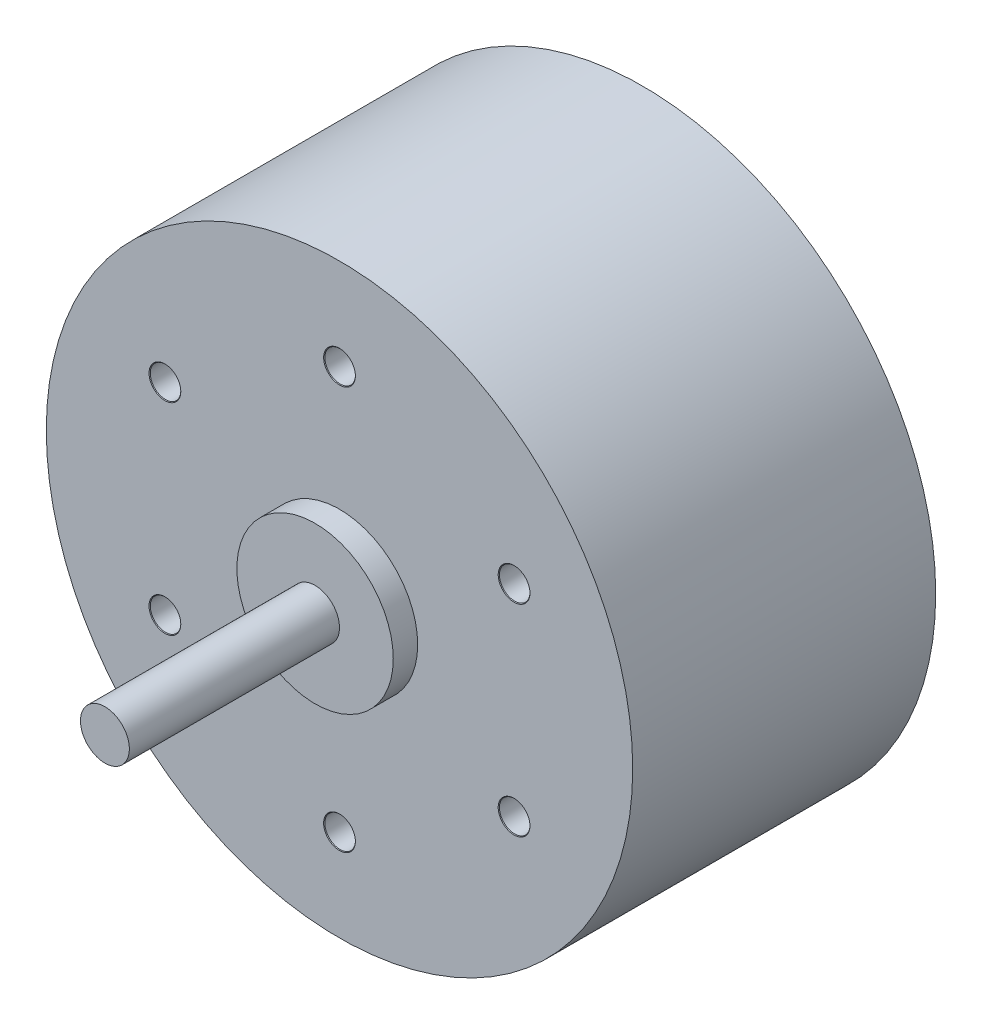
ISO-10303-21;
HEADER;
FILE_DESCRIPTION(('STEP AP214'),'2;1');
FILE_NAME('part.step','',(''),(''),'','','');
FILE_SCHEMA(('AUTOMOTIVE_DESIGN { 1 0 10303 214 1 1 1 1 }'));
ENDSEC;
DATA;
#1=APPLICATION_CONTEXT('core data for automotive mechanical design processes');
#2=APPLICATION_PROTOCOL_DEFINITION('international standard','automotive_design',2000,#1);
#3=PRODUCT_CONTEXT('',#1,'mechanical');
#4=PRODUCT('Part','Part','',(#3));
#5=PRODUCT_RELATED_PRODUCT_CATEGORY('part','',(#4));
#6=PRODUCT_DEFINITION_FORMATION('','',#4);
#7=PRODUCT_DEFINITION_CONTEXT('part definition',#1,'design');
#8=PRODUCT_DEFINITION('design','',#6,#7);
#9=PRODUCT_DEFINITION_SHAPE('','',#8);
#10=(LENGTH_UNIT() NAMED_UNIT(*) SI_UNIT(.MILLI.,.METRE.));
#11=(NAMED_UNIT(*) PLANE_ANGLE_UNIT() SI_UNIT($,.RADIAN.));
#12=(NAMED_UNIT(*) SI_UNIT($,.STERADIAN.) SOLID_ANGLE_UNIT());
#13=UNCERTAINTY_MEASURE_WITH_UNIT(LENGTH_MEASURE(1.E-05),#10,'distance_accuracy_value','');
#14=(GEOMETRIC_REPRESENTATION_CONTEXT(3) GLOBAL_UNCERTAINTY_ASSIGNED_CONTEXT((#13)) GLOBAL_UNIT_ASSIGNED_CONTEXT((#10,
#11,#12)) REPRESENTATION_CONTEXT('',''));
#15=CARTESIAN_POINT('',(0.,0.,0.));
#16=DIRECTION('',(0.,0.,1.));
#17=DIRECTION('',(1.,0.,0.));
#18=AXIS2_PLACEMENT_3D('',#15,#16,#17);
#19=CARTESIAN_POINT('',(0.,0.,-12.4));
#20=DIRECTION('',(0.,0.,1.));
#21=DIRECTION('',(1.,0.,0.));
#22=AXIS2_PLACEMENT_3D('',#19,#20,#21);
#23=CYLINDRICAL_SURFACE('',#22,12.);
#24=CARTESIAN_POINT('',(0.,0.,-12.4));
#25=DIRECTION('',(0.,0.,-1.));
#26=DIRECTION('',(-1.,0.,0.));
#27=AXIS2_PLACEMENT_3D('',#24,#25,#26);
#28=CIRCLE('',#27,12.);
#29=CARTESIAN_POINT('',(12.,0.,-12.4));
#30=VERTEX_POINT('',#29);
#31=EDGE_CURVE('E137',#30,#30,#28,.T.);
#32=CARTESIAN_POINT('',(0.,0.,0.));
#33=DIRECTION('',(0.,0.,-1.));
#34=DIRECTION('',(-1.,0.,0.));
#35=AXIS2_PLACEMENT_3D('',#32,#33,#34);
#36=CIRCLE('',#35,12.);
#37=CARTESIAN_POINT('',(12.,0.,0.));
#38=VERTEX_POINT('',#37);
#39=EDGE_CURVE('E37',#38,#38,#36,.T.);
#40=CARTESIAN_POINT('',(12.,0.,-12.4));
#41=CARTESIAN_POINT('',(12.,0.,-12.2708333333333));
#42=CARTESIAN_POINT('',(12.,0.,-12.1416666666667));
#43=CARTESIAN_POINT('',(12.,0.,-11.8833333333333));
#44=CARTESIAN_POINT('',(12.,0.,-11.7541666666667));
#45=CARTESIAN_POINT('',(12.,0.,-11.4958333333333));
#46=CARTESIAN_POINT('',(12.,0.,-11.3666666666667));
#47=CARTESIAN_POINT('',(12.,0.,-11.1083333333333));
#48=CARTESIAN_POINT('',(12.,0.,-10.9791666666667));
#49=CARTESIAN_POINT('',(12.,0.,-10.7208333333333));
#50=CARTESIAN_POINT('',(12.,0.,-10.5916666666667));
#51=CARTESIAN_POINT('',(12.,0.,-10.3333333333333));
#52=CARTESIAN_POINT('',(12.,0.,-10.2041666666667));
#53=CARTESIAN_POINT('',(12.,0.,-9.94583333333333));
#54=CARTESIAN_POINT('',(12.,0.,-9.81666666666666));
#55=CARTESIAN_POINT('',(12.,0.,-9.55833333333333));
#56=CARTESIAN_POINT('',(12.,0.,-9.42916666666667));
#57=CARTESIAN_POINT('',(12.,0.,-9.17083333333333));
#58=CARTESIAN_POINT('',(12.,0.,-9.04166666666667));
#59=CARTESIAN_POINT('',(12.,0.,-8.78333333333333));
#60=CARTESIAN_POINT('',(12.,0.,-8.65416666666667));
#61=CARTESIAN_POINT('',(12.,0.,-8.39583333333333));
#62=CARTESIAN_POINT('',(12.,0.,-8.26666666666667));
#63=CARTESIAN_POINT('',(12.,0.,-8.00833333333333));
#64=CARTESIAN_POINT('',(12.,0.,-7.87916666666667));
#65=CARTESIAN_POINT('',(12.,0.,-7.62083333333333));
#66=CARTESIAN_POINT('',(12.,0.,-7.49166666666667));
#67=CARTESIAN_POINT('',(12.,0.,-7.23333333333333));
#68=CARTESIAN_POINT('',(12.,0.,-7.10416666666667));
#69=CARTESIAN_POINT('',(12.,0.,-6.84583333333333));
#70=CARTESIAN_POINT('',(12.,0.,-6.71666666666667));
#71=CARTESIAN_POINT('',(12.,0.,-6.45833333333333));
#72=CARTESIAN_POINT('',(12.,0.,-6.32916666666667));
#73=CARTESIAN_POINT('',(12.,0.,-6.07083333333333));
#74=CARTESIAN_POINT('',(12.,0.,-5.94166666666667));
#75=CARTESIAN_POINT('',(12.,0.,-5.68333333333333));
#76=CARTESIAN_POINT('',(12.,0.,-5.55416666666667));
#77=CARTESIAN_POINT('',(12.,0.,-5.29583333333333));
#78=CARTESIAN_POINT('',(12.,0.,-5.16666666666667));
#79=CARTESIAN_POINT('',(12.,0.,-4.90833333333333));
#80=CARTESIAN_POINT('',(12.,0.,-4.77916666666667));
#81=CARTESIAN_POINT('',(12.,0.,-4.52083333333333));
#82=CARTESIAN_POINT('',(12.,0.,-4.39166666666667));
#83=CARTESIAN_POINT('',(12.,0.,-4.13333333333333));
#84=CARTESIAN_POINT('',(12.,0.,-4.00416666666667));
#85=CARTESIAN_POINT('',(12.,0.,-3.74583333333333));
#86=CARTESIAN_POINT('',(12.,0.,-3.61666666666667));
#87=CARTESIAN_POINT('',(12.,0.,-3.35833333333333));
#88=CARTESIAN_POINT('',(12.,0.,-3.22916666666667));
#89=CARTESIAN_POINT('',(12.,0.,-2.97083333333333));
#90=CARTESIAN_POINT('',(12.,0.,-2.84166666666667));
#91=CARTESIAN_POINT('',(12.,0.,-2.58333333333333));
#92=CARTESIAN_POINT('',(12.,0.,-2.45416666666667));
#93=CARTESIAN_POINT('',(12.,0.,-2.19583333333333));
#94=CARTESIAN_POINT('',(12.,0.,-2.06666666666667));
#95=CARTESIAN_POINT('',(12.,0.,-1.80833333333333));
#96=CARTESIAN_POINT('',(12.,0.,-1.67916666666667));
#97=CARTESIAN_POINT('',(12.,0.,-1.42083333333333));
#98=CARTESIAN_POINT('',(12.,0.,-1.29166666666667));
#99=CARTESIAN_POINT('',(12.,0.,-1.03333333333333));
#100=CARTESIAN_POINT('',(12.,0.,-0.904166666666667));
#101=CARTESIAN_POINT('',(12.,0.,-0.645833333333333));
#102=CARTESIAN_POINT('',(12.,0.,-0.516666666666667));
#103=CARTESIAN_POINT('',(12.,0.,-0.258333333333334));
#104=CARTESIAN_POINT('',(12.,0.,-0.129166666666667));
#105=CARTESIAN_POINT('',(12.,0.,0.));
#106=B_SPLINE_CURVE_WITH_KNOTS('',3,(#40,#41,#42,#43,#44,#45,#46,#47,#48,#49,#50,#51,#52,#53,
#54,#55,#56,#57,#58,#59,#60,#61,#62,#63,#64,#65,#66,#67,#68,#69,#70,#71,#72,#73,#74,#75,#76,#77,
#78,#79,#80,#81,#82,#83,#84,#85,#86,#87,#88,#89,#90,#91,#92,#93,#94,#95,#96,#97,#98,#99,#100,
#101,#102,#103,#104,#105),.UNSPECIFIED.,.F.,.F.,(4,2,2,2,2,2,2,2,2,2,2,2,2,2,2,2,2,2,2,2,2,2,2,
2,2,2,2,2,2,2,2,2,4),(0.,0.387499999999999,0.775,1.1625,1.55,1.9375,2.325,2.7125,3.1,3.4875,
3.875,4.2625,4.65,5.0375,5.425,5.8125,6.2,6.5875,6.975,7.3625,7.75,8.1375,8.525,8.9125,9.3,
9.6875,10.075,10.4625,10.85,11.2375,11.625,12.0125,12.4),.UNSPECIFIED.);
#107=EDGE_CURVE('BSEAM34',#30,#38,#106,.T.);
#108=ORIENTED_EDGE('',*,*,#31,.F.);
#109=ORIENTED_EDGE('',*,*,#39,.T.);
#110=ORIENTED_EDGE('',*,*,#107,.T.);
#111=ORIENTED_EDGE('',*,*,#107,.F.);
#112=EDGE_LOOP('',(#108,#110,#109,#111));
#113=FACE_BOUND('',#112,.T.);
#114=ADVANCED_FACE('F34',(#113),#23,.T.);
#115=CARTESIAN_POINT('',(0.,0.,-12.4));
#116=DIRECTION('',(0.,0.,-1.));
#117=DIRECTION('',(-1.,0.,0.));
#118=AXIS2_PLACEMENT_3D('',#115,#116,#117);
#119=PLANE('',#118);
#120=CARTESIAN_POINT('',(0.,0.,-12.4));
#121=DIRECTION('',(0.,0.,-1.));
#122=DIRECTION('',(-1.,0.,0.));
#123=AXIS2_PLACEMENT_3D('',#120,#121,#122);
#124=CIRCLE('',#123,3.);
#125=CARTESIAN_POINT('',(-3.,0.,-12.4));
#126=VERTEX_POINT('',#125);
#127=EDGE_CURVE('E11',#126,#126,#124,.T.);
#128=ORIENTED_EDGE('',*,*,#127,.F.);
#129=EDGE_LOOP('',(#128));
#130=FACE_BOUND('',#129,.T.);
#131=ORIENTED_EDGE('',*,*,#31,.T.);
#132=EDGE_LOOP('',(#131));
#133=FACE_BOUND('',#132,.T.);
#134=ADVANCED_FACE('F148',(#130,#133),#119,.T.);
#135=CARTESIAN_POINT('',(0.,0.,0.));
#136=DIRECTION('',(0.,0.,-1.));
#137=DIRECTION('',(-1.,0.,0.));
#138=AXIS2_PLACEMENT_3D('',#135,#136,#137);
#139=PLANE('',#138);
#140=CARTESIAN_POINT('',(0.,8.25,0.));
#141=DIRECTION('',(0.,0.,1.));
#142=DIRECTION('',(1.,0.,0.));
#143=AXIS2_PLACEMENT_3D('',#140,#141,#142);
#144=CIRCLE('',#143,0.65);
#145=CARTESIAN_POINT('',(0.65,8.25,0.));
#146=VERTEX_POINT('',#145);
#147=EDGE_CURVE('E79',#146,#146,#144,.T.);
#148=ORIENTED_EDGE('',*,*,#147,.F.);
#149=EDGE_LOOP('',(#148));
#150=FACE_BOUND('',#149,.T.);
#151=CARTESIAN_POINT('',(7.14470958122177,4.12499999999973,0.));
#152=DIRECTION('',(0.,0.,1.));
#153=DIRECTION('',(1.,0.,0.));
#154=AXIS2_PLACEMENT_3D('',#151,#152,#153);
#155=CIRCLE('',#154,0.65);
#156=CARTESIAN_POINT('',(7.79470958122177,4.12499999999973,0.));
#157=VERTEX_POINT('',#156);
#158=EDGE_CURVE('E72',#157,#157,#155,.T.);
#159=ORIENTED_EDGE('',*,*,#158,.F.);
#160=EDGE_LOOP('',(#159));
#161=FACE_BOUND('',#160,.T.);
#162=CARTESIAN_POINT('',(7.14470958122131,-4.12500000000054,0.));
#163=DIRECTION('',(0.,0.,1.));
#164=DIRECTION('',(1.,0.,0.));
#165=AXIS2_PLACEMENT_3D('',#162,#163,#164);
#166=CIRCLE('',#165,0.65);
#167=CARTESIAN_POINT('',(7.79470958122131,-4.12500000000054,0.));
#168=VERTEX_POINT('',#167);
#169=EDGE_CURVE('E88',#168,#168,#166,.T.);
#170=ORIENTED_EDGE('',*,*,#169,.F.);
#171=EDGE_LOOP('',(#170));
#172=FACE_BOUND('',#171,.T.);
#173=CARTESIAN_POINT('',(-9.2957860563151E-13,-8.25,0.));
#174=DIRECTION('',(0.,0.,1.));
#175=DIRECTION('',(1.,0.,0.));
#176=AXIS2_PLACEMENT_3D('',#173,#174,#175);
#177=CIRCLE('',#176,0.65);
#178=CARTESIAN_POINT('',(0.64999999999907,-8.25,0.));
#179=VERTEX_POINT('',#178);
#180=EDGE_CURVE('E97',#179,#179,#177,.T.);
#181=ORIENTED_EDGE('',*,*,#180,.F.);
#182=EDGE_LOOP('',(#181));
#183=FACE_BOUND('',#182,.T.);
#184=CARTESIAN_POINT('',(-7.14470958122224,-4.12499999999892,0.));
#185=DIRECTION('',(0.,0.,1.));
#186=DIRECTION('',(1.,0.,0.));
#187=AXIS2_PLACEMENT_3D('',#184,#185,#186);
#188=CIRCLE('',#187,0.65);
#189=CARTESIAN_POINT('',(-6.49470958122224,-4.12499999999892,0.));
#190=VERTEX_POINT('',#189);
#191=EDGE_CURVE('E106',#190,#190,#188,.T.);
#192=ORIENTED_EDGE('',*,*,#191,.F.);
#193=EDGE_LOOP('',(#192));
#194=FACE_BOUND('',#193,.T.);
#195=CARTESIAN_POINT('',(-7.14470958122084,4.12500000000135,0.));
#196=DIRECTION('',(0.,0.,1.));
#197=DIRECTION('',(1.,0.,0.));
#198=AXIS2_PLACEMENT_3D('',#195,#196,#197);
#199=CIRCLE('',#198,0.65);
#200=CARTESIAN_POINT('',(-6.49470958122084,4.12500000000135,0.));
#201=VERTEX_POINT('',#200);
#202=EDGE_CURVE('E115',#201,#201,#199,.T.);
#203=ORIENTED_EDGE('',*,*,#202,.F.);
#204=EDGE_LOOP('',(#203));
#205=FACE_BOUND('',#204,.T.);
#206=CARTESIAN_POINT('',(0.,0.,0.));
#207=DIRECTION('',(0.,0.,1.));
#208=DIRECTION('',(1.,0.,0.));
#209=AXIS2_PLACEMENT_3D('',#206,#207,#208);
#210=CIRCLE('',#209,3.2);
#211=CARTESIAN_POINT('',(3.2,0.,0.));
#212=VERTEX_POINT('',#211);
#213=EDGE_CURVE('E133',#212,#212,#210,.T.);
#214=ORIENTED_EDGE('',*,*,#213,.F.);
#215=EDGE_LOOP('',(#214));
#216=FACE_BOUND('',#215,.T.);
#217=ORIENTED_EDGE('',*,*,#39,.F.);
#218=EDGE_LOOP('',(#217));
#219=FACE_BOUND('',#218,.T.);
#220=ADVANCED_FACE('F145',(#150,#161,#172,#183,#194,#205,#216,#219),#139,.F.);
#221=CARTESIAN_POINT('',(0.,0.,1.));
#222=DIRECTION('',(0.,0.,-1.));
#223=DIRECTION('',(-1.,0.,0.));
#224=AXIS2_PLACEMENT_3D('',#221,#222,#223);
#225=CYLINDRICAL_SURFACE('',#224,3.2);
#226=CARTESIAN_POINT('',(0.,0.,1.));
#227=DIRECTION('',(0.,0.,1.));
#228=DIRECTION('',(1.,0.,0.));
#229=AXIS2_PLACEMENT_3D('',#226,#227,#228);
#230=CIRCLE('',#229,3.2);
#231=CARTESIAN_POINT('',(3.2,0.,1.));
#232=VERTEX_POINT('',#231);
#233=EDGE_CURVE('E130',#232,#232,#230,.T.);
#234=ORIENTED_EDGE('',*,*,#233,.F.);
#235=EDGE_LOOP('',(#234));
#236=FACE_BOUND('',#235,.T.);
#237=ORIENTED_EDGE('',*,*,#213,.T.);
#238=EDGE_LOOP('',(#237));
#239=FACE_BOUND('',#238,.T.);
#240=ADVANCED_FACE('F147',(#236,#239),#225,.T.);
#241=CARTESIAN_POINT('',(0.,0.,1.));
#242=DIRECTION('',(0.,0.,1.));
#243=DIRECTION('',(1.,0.,0.));
#244=AXIS2_PLACEMENT_3D('',#241,#242,#243);
#245=PLANE('',#244);
#246=CARTESIAN_POINT('',(0.,0.,1.));
#247=DIRECTION('',(0.,0.,1.));
#248=DIRECTION('',(1.,0.,0.));
#249=AXIS2_PLACEMENT_3D('',#246,#247,#248);
#250=CIRCLE('',#249,1.);
#251=CARTESIAN_POINT('',(-1.,0.,0.999999999999999));
#252=VERTEX_POINT('',#251);
#253=EDGE_CURVE('E42',#252,#252,#250,.T.);
#254=ORIENTED_EDGE('',*,*,#253,.F.);
#255=EDGE_LOOP('',(#254));
#256=FACE_BOUND('',#255,.T.);
#257=ORIENTED_EDGE('',*,*,#233,.T.);
#258=EDGE_LOOP('',(#257));
#259=FACE_BOUND('',#258,.T.);
#260=ADVANCED_FACE('F154',(#256,#259),#245,.T.);
#261=CARTESIAN_POINT('',(0.,0.,9.6));
#262=DIRECTION('',(0.,0.,-1.));
#263=DIRECTION('',(-1.,0.,0.));
#264=AXIS2_PLACEMENT_3D('',#261,#262,#263);
#265=CYLINDRICAL_SURFACE('',#264,1.);
#266=CARTESIAN_POINT('',(0.,0.,9.6));
#267=DIRECTION('',(0.,0.,1.));
#268=DIRECTION('',(1.,0.,0.));
#269=AXIS2_PLACEMENT_3D('',#266,#267,#268);
#270=CIRCLE('',#269,1.);
#271=CARTESIAN_POINT('',(-1.,0.,9.6));
#272=VERTEX_POINT('',#271);
#273=EDGE_CURVE('E126',#272,#272,#270,.T.);
#274=CARTESIAN_POINT('',(-1.,0.,9.6));
#275=CARTESIAN_POINT('',(-1.,0.,9.51041666666667));
#276=CARTESIAN_POINT('',(-1.,0.,9.42083333333333));
#277=CARTESIAN_POINT('',(-1.,0.,9.24166666666667));
#278=CARTESIAN_POINT('',(-1.,0.,9.15208333333333));
#279=CARTESIAN_POINT('',(-1.,0.,8.97291666666666));
#280=CARTESIAN_POINT('',(-1.,0.,8.88333333333333));
#281=CARTESIAN_POINT('',(-1.,0.,8.70416666666667));
#282=CARTESIAN_POINT('',(-1.,0.,8.61458333333333));
#283=CARTESIAN_POINT('',(-1.,0.,8.43541666666667));
#284=CARTESIAN_POINT('',(-1.,0.,8.34583333333333));
#285=CARTESIAN_POINT('',(-1.,0.,8.16666666666667));
#286=CARTESIAN_POINT('',(-1.,0.,8.07708333333333));
#287=CARTESIAN_POINT('',(-1.,0.,7.89791666666667));
#288=CARTESIAN_POINT('',(-1.,0.,7.80833333333333));
#289=CARTESIAN_POINT('',(-1.,0.,7.62916666666667));
#290=CARTESIAN_POINT('',(-1.,0.,7.53958333333333));
#291=CARTESIAN_POINT('',(-1.,0.,7.36041666666667));
#292=CARTESIAN_POINT('',(-1.,0.,7.27083333333333));
#293=CARTESIAN_POINT('',(-1.,0.,7.09166666666667));
#294=CARTESIAN_POINT('',(-1.,0.,7.00208333333333));
#295=CARTESIAN_POINT('',(-1.,0.,6.82291666666667));
#296=CARTESIAN_POINT('',(-1.,0.,6.73333333333333));
#297=CARTESIAN_POINT('',(-1.,0.,6.55416666666667));
#298=CARTESIAN_POINT('',(-1.,0.,6.46458333333333));
#299=CARTESIAN_POINT('',(-1.,0.,6.28541666666667));
#300=CARTESIAN_POINT('',(-1.,0.,6.19583333333333));
#301=CARTESIAN_POINT('',(-1.,0.,6.01666666666667));
#302=CARTESIAN_POINT('',(-1.,0.,5.92708333333333));
#303=CARTESIAN_POINT('',(-1.,0.,5.74791666666667));
#304=CARTESIAN_POINT('',(-1.,0.,5.65833333333333));
#305=CARTESIAN_POINT('',(-1.,0.,5.47916666666667));
#306=CARTESIAN_POINT('',(-1.,0.,5.38958333333333));
#307=CARTESIAN_POINT('',(-1.,0.,5.21041666666667));
#308=CARTESIAN_POINT('',(-1.,0.,5.12083333333333));
#309=CARTESIAN_POINT('',(-1.,0.,4.94166666666667));
#310=CARTESIAN_POINT('',(-1.,0.,4.85208333333333));
#311=CARTESIAN_POINT('',(-1.,0.,4.67291666666667));
#312=CARTESIAN_POINT('',(-1.,0.,4.58333333333333));
#313=CARTESIAN_POINT('',(-1.,0.,4.40416666666667));
#314=CARTESIAN_POINT('',(-1.,0.,4.31458333333333));
#315=CARTESIAN_POINT('',(-1.,0.,4.13541666666667));
#316=CARTESIAN_POINT('',(-1.,0.,4.04583333333333));
#317=CARTESIAN_POINT('',(-1.,0.,3.86666666666667));
#318=CARTESIAN_POINT('',(-1.,0.,3.77708333333333));
#319=CARTESIAN_POINT('',(-1.,0.,3.59791666666666));
#320=CARTESIAN_POINT('',(-1.,0.,3.50833333333333));
#321=CARTESIAN_POINT('',(-1.,0.,3.32916666666666));
#322=CARTESIAN_POINT('',(-1.,0.,3.23958333333333));
#323=CARTESIAN_POINT('',(-1.,0.,3.06041666666667));
#324=CARTESIAN_POINT('',(-1.,0.,2.97083333333333));
#325=CARTESIAN_POINT('',(-1.,0.,2.79166666666666));
#326=CARTESIAN_POINT('',(-1.,0.,2.70208333333333));
#327=CARTESIAN_POINT('',(-1.,0.,2.52291666666666));
#328=CARTESIAN_POINT('',(-1.,0.,2.43333333333333));
#329=CARTESIAN_POINT('',(-1.,0.,2.25416666666666));
#330=CARTESIAN_POINT('',(-1.,0.,2.16458333333333));
#331=CARTESIAN_POINT('',(-1.,0.,1.98541666666666));
#332=CARTESIAN_POINT('',(-1.,0.,1.89583333333333));
#333=CARTESIAN_POINT('',(-1.,0.,1.71666666666667));
#334=CARTESIAN_POINT('',(-1.,0.,1.62708333333333));
#335=CARTESIAN_POINT('',(-1.,0.,1.44791666666667));
#336=CARTESIAN_POINT('',(-1.,0.,1.35833333333333));
#337=CARTESIAN_POINT('',(-1.,0.,1.17916666666667));
#338=CARTESIAN_POINT('',(-1.,0.,1.08958333333333));
#339=CARTESIAN_POINT('',(-1.,0.,0.999999999999999));
#340=B_SPLINE_CURVE_WITH_KNOTS('',3,(#274,#275,#276,#277,#278,#279,#280,#281,#282,#283,#284,
#285,#286,#287,#288,#289,#290,#291,#292,#293,#294,#295,#296,#297,#298,#299,#300,#301,#302,#303,
#304,#305,#306,#307,#308,#309,#310,#311,#312,#313,#314,#315,#316,#317,#318,#319,#320,#321,#322,
#323,#324,#325,#326,#327,#328,#329,#330,#331,#332,#333,#334,#335,#336,#337,#338,#339),
.UNSPECIFIED.,.F.,.F.,(4,2,2,2,2,2,2,2,2,2,2,2,2,2,2,2,2,2,2,2,2,2,2,2,2,2,2,2,2,2,2,2,4),(0.,
0.268750000000002,0.537500000000002,0.806250000000001,1.075,1.34375,1.6125,1.88125,2.15,2.41875,
2.6875,2.95625,3.225,3.49375,3.7625,4.03125,4.3,4.56875,4.8375,5.10625,5.375,5.64375,5.9125,
6.18125,6.45,6.71875,6.9875,7.25625,7.525,7.79375,8.0625,8.33125,8.6),.UNSPECIFIED.);
#341=EDGE_CURVE('BSEAM380',#272,#252,#340,.T.);
#342=ORIENTED_EDGE('',*,*,#273,.F.);
#343=ORIENTED_EDGE('',*,*,#253,.T.);
#344=ORIENTED_EDGE('',*,*,#341,.T.);
#345=ORIENTED_EDGE('',*,*,#341,.F.);
#346=EDGE_LOOP('',(#342,#344,#343,#345));
#347=FACE_BOUND('',#346,.T.);
#348=ADVANCED_FACE('F380',(#347),#265,.T.);
#349=CARTESIAN_POINT('',(0.,0.,9.6));
#350=DIRECTION('',(0.,0.,1.));
#351=DIRECTION('',(1.,0.,0.));
#352=AXIS2_PLACEMENT_3D('',#349,#350,#351);
#353=PLANE('',#352);
#354=ORIENTED_EDGE('',*,*,#273,.T.);
#355=EDGE_LOOP('',(#354));
#356=FACE_BOUND('',#355,.T.);
#357=ADVANCED_FACE('F177',(#356),#353,.T.);
#358=CARTESIAN_POINT('',(0.,0.,-13.1));
#359=DIRECTION('',(0.,0.,1.));
#360=DIRECTION('',(1.,0.,0.));
#361=AXIS2_PLACEMENT_3D('',#358,#359,#360);
#362=CYLINDRICAL_SURFACE('',#361,3.);
#363=CARTESIAN_POINT('',(0.,0.,-13.1));
#364=DIRECTION('',(0.,0.,-1.));
#365=DIRECTION('',(-1.,0.,0.));
#366=AXIS2_PLACEMENT_3D('',#363,#364,#365);
#367=CIRCLE('',#366,3.);
#368=CARTESIAN_POINT('',(-3.,0.,-13.1));
#369=VERTEX_POINT('',#368);
#370=EDGE_CURVE('E124',#369,#369,#367,.T.);
#371=ORIENTED_EDGE('',*,*,#370,.F.);
#372=EDGE_LOOP('',(#371));
#373=FACE_BOUND('',#372,.T.);
#374=ORIENTED_EDGE('',*,*,#127,.T.);
#375=EDGE_LOOP('',(#374));
#376=FACE_BOUND('',#375,.T.);
#377=ADVANCED_FACE('F182',(#373,#376),#362,.T.);
#378=CARTESIAN_POINT('',(0.,0.,-13.1));
#379=DIRECTION('',(0.,0.,-1.));
#380=DIRECTION('',(-1.,0.,0.));
#381=AXIS2_PLACEMENT_3D('',#378,#379,#380);
#382=PLANE('',#381);
#383=ORIENTED_EDGE('',*,*,#370,.T.);
#384=EDGE_LOOP('',(#383));
#385=FACE_BOUND('',#384,.T.);
#386=ADVANCED_FACE('F187',(#385),#382,.T.);
#387=CARTESIAN_POINT('',(-7.14470958122084,4.12500000000135,-2.));
#388=DIRECTION('',(0.,0.,1.));
#389=DIRECTION('',(1.,0.,0.));
#390=AXIS2_PLACEMENT_3D('',#387,#388,#389);
#391=CONICAL_SURFACE('',#390,0.624999999999998,1.02974425867665);
#392=CARTESIAN_POINT('',(-7.14470958122084,4.12500000000135,-2.37553788689223));
#393=VERTEX_POINT('',#392);
#394=VERTEX_LOOP('',#393);
#395=FACE_BOUND('',#394,.T.);
#396=CARTESIAN_POINT('',(-7.14470958122084,4.12500000000135,-2.));
#397=DIRECTION('',(0.,0.,1.));
#398=DIRECTION('',(1.,0.,0.));
#399=AXIS2_PLACEMENT_3D('',#396,#397,#398);
#400=CIRCLE('',#399,0.624999999999998);
#401=CARTESIAN_POINT('',(-6.51970958122085,4.12500000000135,-2.));
#402=VERTEX_POINT('',#401);
#403=EDGE_CURVE('E121',#402,#402,#400,.T.);
#404=ORIENTED_EDGE('',*,*,#403,.T.);
#405=EDGE_LOOP('',(#404));
#406=FACE_BOUND('',#405,.T.);
#407=ADVANCED_FACE('F196',(#395,#406),#391,.F.);
#408=CARTESIAN_POINT('',(-7.14470958122084,4.12500000000135,0.));
#409=DIRECTION('',(0.,0.,1.));
#410=DIRECTION('',(1.,0.,0.));
#411=AXIS2_PLACEMENT_3D('',#408,#409,#410);
#412=CYLINDRICAL_SURFACE('',#411,0.624999999999998);
#413=ORIENTED_EDGE('',*,*,#403,.F.);
#414=EDGE_LOOP('',(#413));
#415=FACE_BOUND('',#414,.T.);
#416=CARTESIAN_POINT('',(-7.14470958122084,4.12500000000135,-0.0250000000000007));
#417=DIRECTION('',(0.,0.,1.));
#418=DIRECTION('',(1.,0.,0.));
#419=AXIS2_PLACEMENT_3D('',#416,#417,#418);
#420=CIRCLE('',#419,0.624999999999999);
#421=CARTESIAN_POINT('',(-6.51970958122084,4.12500000000135,-0.0250000000000007));
#422=VERTEX_POINT('',#421);
#423=EDGE_CURVE('E118',#422,#422,#420,.T.);
#424=ORIENTED_EDGE('',*,*,#423,.T.);
#425=EDGE_LOOP('',(#424));
#426=FACE_BOUND('',#425,.T.);
#427=ADVANCED_FACE('F211',(#415,#426),#412,.F.);
#428=CARTESIAN_POINT('',(-7.14470958122084,4.12500000000135,0.));
#429=DIRECTION('',(0.,0.,1.));
#430=DIRECTION('',(1.,0.,0.));
#431=AXIS2_PLACEMENT_3D('',#428,#429,#430);
#432=CONICAL_SURFACE('',#431,0.65,0.785398163397414);
#433=ORIENTED_EDGE('',*,*,#423,.F.);
#434=EDGE_LOOP('',(#433));
#435=FACE_BOUND('',#434,.T.);
#436=ORIENTED_EDGE('',*,*,#202,.T.);
#437=EDGE_LOOP('',(#436));
#438=FACE_BOUND('',#437,.T.);
#439=ADVANCED_FACE('F220',(#435,#438),#432,.F.);
#440=CARTESIAN_POINT('',(-7.14470958122224,-4.12499999999892,-2.));
#441=DIRECTION('',(0.,0.,1.));
#442=DIRECTION('',(1.,0.,0.));
#443=AXIS2_PLACEMENT_3D('',#440,#441,#442);
#444=CONICAL_SURFACE('',#443,0.624999999999998,1.02974425867665);
#445=CARTESIAN_POINT('',(-7.14470958122224,-4.12499999999892,-2.37553788689223));
#446=VERTEX_POINT('',#445);
#447=VERTEX_LOOP('',#446);
#448=FACE_BOUND('',#447,.T.);
#449=CARTESIAN_POINT('',(-7.14470958122224,-4.12499999999892,-2.));
#450=DIRECTION('',(0.,0.,1.));
#451=DIRECTION('',(1.,0.,0.));
#452=AXIS2_PLACEMENT_3D('',#449,#450,#451);
#453=CIRCLE('',#452,0.624999999999998);
#454=CARTESIAN_POINT('',(-6.51970958122224,-4.12499999999892,-2.));
#455=VERTEX_POINT('',#454);
#456=EDGE_CURVE('E112',#455,#455,#453,.T.);
#457=ORIENTED_EDGE('',*,*,#456,.T.);
#458=EDGE_LOOP('',(#457));
#459=FACE_BOUND('',#458,.T.);
#460=ADVANCED_FACE('F230',(#448,#459),#444,.F.);
#461=CARTESIAN_POINT('',(-7.14470958122224,-4.12499999999892,0.));
#462=DIRECTION('',(0.,0.,1.));
#463=DIRECTION('',(1.,0.,0.));
#464=AXIS2_PLACEMENT_3D('',#461,#462,#463);
#465=CYLINDRICAL_SURFACE('',#464,0.624999999999998);
#466=ORIENTED_EDGE('',*,*,#456,.F.);
#467=EDGE_LOOP('',(#466));
#468=FACE_BOUND('',#467,.T.);
#469=CARTESIAN_POINT('',(-7.14470958122224,-4.12499999999892,-0.0250000000000007));
#470=DIRECTION('',(0.,0.,1.));
#471=DIRECTION('',(1.,0.,0.));
#472=AXIS2_PLACEMENT_3D('',#469,#470,#471);
#473=CIRCLE('',#472,0.624999999999999);
#474=CARTESIAN_POINT('',(-6.51970958122224,-4.12499999999892,-0.0250000000000007));
#475=VERTEX_POINT('',#474);
#476=EDGE_CURVE('E109',#475,#475,#473,.T.);
#477=ORIENTED_EDGE('',*,*,#476,.T.);
#478=EDGE_LOOP('',(#477));
#479=FACE_BOUND('',#478,.T.);
#480=ADVANCED_FACE('F240',(#468,#479),#465,.F.);
#481=CARTESIAN_POINT('',(-7.14470958122224,-4.12499999999892,0.));
#482=DIRECTION('',(0.,0.,1.));
#483=DIRECTION('',(1.,0.,0.));
#484=AXIS2_PLACEMENT_3D('',#481,#482,#483);
#485=CONICAL_SURFACE('',#484,0.65,0.785398163397414);
#486=ORIENTED_EDGE('',*,*,#476,.F.);
#487=EDGE_LOOP('',(#486));
#488=FACE_BOUND('',#487,.T.);
#489=ORIENTED_EDGE('',*,*,#191,.T.);
#490=EDGE_LOOP('',(#489));
#491=FACE_BOUND('',#490,.T.);
#492=ADVANCED_FACE('F249',(#488,#491),#485,.F.);
#493=CARTESIAN_POINT('',(-9.2957860563151E-13,-8.25,-2.));
#494=DIRECTION('',(0.,0.,1.));
#495=DIRECTION('',(1.,0.,0.));
#496=AXIS2_PLACEMENT_3D('',#493,#494,#495);
#497=CONICAL_SURFACE('',#496,0.624999999999998,1.02974425867665);
#498=CARTESIAN_POINT('',(-9.30160444605397E-13,-8.25,-2.37553788689223));
#499=VERTEX_POINT('',#498);
#500=VERTEX_LOOP('',#499);
#501=FACE_BOUND('',#500,.T.);
#502=CARTESIAN_POINT('',(-9.2957860563151E-13,-8.25,-2.));
#503=DIRECTION('',(0.,0.,1.));
#504=DIRECTION('',(1.,0.,0.));
#505=AXIS2_PLACEMENT_3D('',#502,#503,#504);
#506=CIRCLE('',#505,0.624999999999998);
#507=CARTESIAN_POINT('',(0.624999999999069,-8.25,-2.));
#508=VERTEX_POINT('',#507);
#509=EDGE_CURVE('E103',#508,#508,#506,.T.);
#510=ORIENTED_EDGE('',*,*,#509,.T.);
#511=EDGE_LOOP('',(#510));
#512=FACE_BOUND('',#511,.T.);
#513=ADVANCED_FACE('F259',(#501,#512),#497,.F.);
#514=CARTESIAN_POINT('',(-9.2957860563151E-13,-8.25,0.));
#515=DIRECTION('',(0.,0.,1.));
#516=DIRECTION('',(1.,0.,0.));
#517=AXIS2_PLACEMENT_3D('',#514,#515,#516);
#518=CYLINDRICAL_SURFACE('',#517,0.624999999999998);
#519=ORIENTED_EDGE('',*,*,#509,.F.);
#520=EDGE_LOOP('',(#519));
#521=FACE_BOUND('',#520,.T.);
#522=CARTESIAN_POINT('',(-9.2957860563151E-13,-8.25,-0.0250000000000007));
#523=DIRECTION('',(0.,0.,1.));
#524=DIRECTION('',(1.,0.,0.));
#525=AXIS2_PLACEMENT_3D('',#522,#523,#524);
#526=CIRCLE('',#525,0.624999999999998);
#527=CARTESIAN_POINT('',(0.624999999999069,-8.25,-0.0250000000000007));
#528=VERTEX_POINT('',#527);
#529=EDGE_CURVE('E100',#528,#528,#526,.T.);
#530=ORIENTED_EDGE('',*,*,#529,.T.);
#531=EDGE_LOOP('',(#530));
#532=FACE_BOUND('',#531,.T.);
#533=ADVANCED_FACE('F269',(#521,#532),#518,.F.);
#534=CARTESIAN_POINT('',(-9.2957860563151E-13,-8.25,0.));
#535=DIRECTION('',(0.,0.,1.));
#536=DIRECTION('',(1.,0.,0.));
#537=AXIS2_PLACEMENT_3D('',#534,#535,#536);
#538=CONICAL_SURFACE('',#537,0.65,0.785398163397422);
#539=ORIENTED_EDGE('',*,*,#529,.F.);
#540=EDGE_LOOP('',(#539));
#541=FACE_BOUND('',#540,.T.);
#542=ORIENTED_EDGE('',*,*,#180,.T.);
#543=EDGE_LOOP('',(#542));
#544=FACE_BOUND('',#543,.T.);
#545=ADVANCED_FACE('F279',(#541,#544),#538,.F.);
#546=CARTESIAN_POINT('',(7.14470958122131,-4.12500000000054,-2.));
#547=DIRECTION('',(0.,0.,1.));
#548=DIRECTION('',(1.,0.,0.));
#549=AXIS2_PLACEMENT_3D('',#546,#547,#548);
#550=CONICAL_SURFACE('',#549,0.624999999999998,1.02974425867665);
#551=CARTESIAN_POINT('',(7.14470958122131,-4.12500000000054,-2.37553788689223));
#552=VERTEX_POINT('',#551);
#553=VERTEX_LOOP('',#552);
#554=FACE_BOUND('',#553,.T.);
#555=CARTESIAN_POINT('',(7.14470958122131,-4.12500000000054,-2.));
#556=DIRECTION('',(0.,0.,1.));
#557=DIRECTION('',(1.,0.,0.));
#558=AXIS2_PLACEMENT_3D('',#555,#556,#557);
#559=CIRCLE('',#558,0.624999999999998);
#560=CARTESIAN_POINT('',(7.76970958122131,-4.12500000000054,-2.));
#561=VERTEX_POINT('',#560);
#562=EDGE_CURVE('E94',#561,#561,#559,.T.);
#563=ORIENTED_EDGE('',*,*,#562,.T.);
#564=EDGE_LOOP('',(#563));
#565=FACE_BOUND('',#564,.T.);
#566=ADVANCED_FACE('F289',(#554,#565),#550,.F.);
#567=CARTESIAN_POINT('',(7.14470958122131,-4.12500000000054,0.));
#568=DIRECTION('',(0.,0.,1.));
#569=DIRECTION('',(1.,0.,0.));
#570=AXIS2_PLACEMENT_3D('',#567,#568,#569);
#571=CYLINDRICAL_SURFACE('',#570,0.624999999999998);
#572=ORIENTED_EDGE('',*,*,#562,.F.);
#573=EDGE_LOOP('',(#572));
#574=FACE_BOUND('',#573,.T.);
#575=CARTESIAN_POINT('',(7.14470958122131,-4.12500000000054,-0.0250000000000007));
#576=DIRECTION('',(0.,0.,1.));
#577=DIRECTION('',(1.,0.,0.));
#578=AXIS2_PLACEMENT_3D('',#575,#576,#577);
#579=CIRCLE('',#578,0.624999999999998);
#580=CARTESIAN_POINT('',(7.76970958122131,-4.12500000000054,-0.0250000000000007));
#581=VERTEX_POINT('',#580);
#582=EDGE_CURVE('E91',#581,#581,#579,.T.);
#583=ORIENTED_EDGE('',*,*,#582,.T.);
#584=EDGE_LOOP('',(#583));
#585=FACE_BOUND('',#584,.T.);
#586=ADVANCED_FACE('F299',(#574,#585),#571,.F.);
#587=CARTESIAN_POINT('',(7.14470958122131,-4.12500000000054,0.));
#588=DIRECTION('',(0.,0.,1.));
#589=DIRECTION('',(1.,0.,0.));
#590=AXIS2_PLACEMENT_3D('',#587,#588,#589);
#591=CONICAL_SURFACE('',#590,0.65,0.785398163397431);
#592=ORIENTED_EDGE('',*,*,#582,.F.);
#593=EDGE_LOOP('',(#592));
#594=FACE_BOUND('',#593,.T.);
#595=ORIENTED_EDGE('',*,*,#169,.T.);
#596=EDGE_LOOP('',(#595));
#597=FACE_BOUND('',#596,.T.);
#598=ADVANCED_FACE('F309',(#594,#597),#591,.F.);
#599=CARTESIAN_POINT('',(7.14470958122177,4.12499999999973,-2.));
#600=DIRECTION('',(0.,0.,1.));
#601=DIRECTION('',(1.,0.,0.));
#602=AXIS2_PLACEMENT_3D('',#599,#600,#601);
#603=CONICAL_SURFACE('',#602,0.624999999999998,1.02974425867665);
#604=CARTESIAN_POINT('',(7.14470958122177,4.12499999999973,-2.37553788689223));
#605=VERTEX_POINT('',#604);
#606=VERTEX_LOOP('',#605);
#607=FACE_BOUND('',#606,.T.);
#608=CARTESIAN_POINT('',(7.14470958122177,4.12499999999973,-2.));
#609=DIRECTION('',(0.,0.,1.));
#610=DIRECTION('',(1.,0.,0.));
#611=AXIS2_PLACEMENT_3D('',#608,#609,#610);
#612=CIRCLE('',#611,0.624999999999998);
#613=CARTESIAN_POINT('',(7.76970958122177,4.12499999999973,-2.));
#614=VERTEX_POINT('',#613);
#615=EDGE_CURVE('E85',#614,#614,#612,.T.);
#616=ORIENTED_EDGE('',*,*,#615,.T.);
#617=EDGE_LOOP('',(#616));
#618=FACE_BOUND('',#617,.T.);
#619=ADVANCED_FACE('F319',(#607,#618),#603,.F.);
#620=CARTESIAN_POINT('',(7.14470958122177,4.12499999999973,0.));
#621=DIRECTION('',(0.,0.,1.));
#622=DIRECTION('',(1.,0.,0.));
#623=AXIS2_PLACEMENT_3D('',#620,#621,#622);
#624=CYLINDRICAL_SURFACE('',#623,0.624999999999998);
#625=ORIENTED_EDGE('',*,*,#615,.F.);
#626=EDGE_LOOP('',(#625));
#627=FACE_BOUND('',#626,.T.);
#628=CARTESIAN_POINT('',(7.14470958122177,4.12499999999973,-0.0250000000000007));
#629=DIRECTION('',(0.,0.,1.));
#630=DIRECTION('',(1.,0.,0.));
#631=AXIS2_PLACEMENT_3D('',#628,#629,#630);
#632=CIRCLE('',#631,0.624999999999999);
#633=CARTESIAN_POINT('',(7.76970958122177,4.12499999999973,-0.0250000000000007));
#634=VERTEX_POINT('',#633);
#635=EDGE_CURVE('E76',#634,#634,#632,.T.);
#636=ORIENTED_EDGE('',*,*,#635,.T.);
#637=EDGE_LOOP('',(#636));
#638=FACE_BOUND('',#637,.T.);
#639=ADVANCED_FACE('F329',(#627,#638),#624,.F.);
#640=CARTESIAN_POINT('',(7.14470958122177,4.12499999999973,0.));
#641=DIRECTION('',(0.,0.,1.));
#642=DIRECTION('',(1.,0.,0.));
#643=AXIS2_PLACEMENT_3D('',#640,#641,#642);
#644=CONICAL_SURFACE('',#643,0.65,0.785398163397414);
#645=ORIENTED_EDGE('',*,*,#635,.F.);
#646=EDGE_LOOP('',(#645));
#647=FACE_BOUND('',#646,.T.);
#648=ORIENTED_EDGE('',*,*,#158,.T.);
#649=EDGE_LOOP('',(#648));
#650=FACE_BOUND('',#649,.T.);
#651=ADVANCED_FACE('F66',(#647,#650),#644,.F.);
#652=CARTESIAN_POINT('',(0.,8.25,-2.));
#653=DIRECTION('',(0.,0.,1.));
#654=DIRECTION('',(1.,0.,0.));
#655=AXIS2_PLACEMENT_3D('',#652,#653,#654);
#656=CONICAL_SURFACE('',#655,0.624999999999998,1.02974425867665);
#657=CARTESIAN_POINT('',(0.,8.25,-2.37553788689223));
#658=VERTEX_POINT('',#657);
#659=VERTEX_LOOP('',#658);
#660=FACE_BOUND('',#659,.T.);
#661=CARTESIAN_POINT('',(0.,8.25,-2.));
#662=DIRECTION('',(0.,0.,1.));
#663=DIRECTION('',(1.,0.,0.));
#664=AXIS2_PLACEMENT_3D('',#661,#662,#663);
#665=CIRCLE('',#664,0.624999999999998);
#666=CARTESIAN_POINT('',(0.624999999999998,8.25,-2.));
#667=VERTEX_POINT('',#666);
#668=EDGE_CURVE('E70',#667,#667,#665,.T.);
#669=ORIENTED_EDGE('',*,*,#668,.T.);
#670=EDGE_LOOP('',(#669));
#671=FACE_BOUND('',#670,.T.);
#672=ADVANCED_FACE('F62',(#660,#671),#656,.F.);
#673=CARTESIAN_POINT('',(0.,8.25,0.));
#674=DIRECTION('',(0.,0.,1.));
#675=DIRECTION('',(1.,0.,0.));
#676=AXIS2_PLACEMENT_3D('',#673,#674,#675);
#677=CYLINDRICAL_SURFACE('',#676,0.624999999999998);
#678=ORIENTED_EDGE('',*,*,#668,.F.);
#679=EDGE_LOOP('',(#678));
#680=FACE_BOUND('',#679,.T.);
#681=CARTESIAN_POINT('',(0.,8.25,-0.0250000000000007));
#682=DIRECTION('',(0.,0.,1.));
#683=DIRECTION('',(1.,0.,0.));
#684=AXIS2_PLACEMENT_3D('',#681,#682,#683);
#685=CIRCLE('',#684,0.624999999999998);
#686=CARTESIAN_POINT('',(0.624999999999998,8.25,-0.0250000000000007));
#687=VERTEX_POINT('',#686);
#688=EDGE_CURVE('E73',#687,#687,#685,.T.);
#689=ORIENTED_EDGE('',*,*,#688,.T.);
#690=EDGE_LOOP('',(#689));
#691=FACE_BOUND('',#690,.T.);
#692=ADVANCED_FACE('F65',(#680,#691),#677,.F.);
#693=CARTESIAN_POINT('',(0.,8.25,0.));
#694=DIRECTION('',(0.,0.,1.));
#695=DIRECTION('',(1.,0.,0.));
#696=AXIS2_PLACEMENT_3D('',#693,#694,#695);
#697=CONICAL_SURFACE('',#696,0.65,0.785398163397422);
#698=ORIENTED_EDGE('',*,*,#688,.F.);
#699=EDGE_LOOP('',(#698));
#700=FACE_BOUND('',#699,.T.);
#701=ORIENTED_EDGE('',*,*,#147,.T.);
#702=EDGE_LOOP('',(#701));
#703=FACE_BOUND('',#702,.T.);
#704=ADVANCED_FACE('F363',(#700,#703),#697,.F.);
#705=CLOSED_SHELL('',(#114,#134,#220,#240,#260,#348,#357,#377,#386,#407,#427,#439,#460,#480,
#492,#513,#533,#545,#566,#586,#598,#619,#639,#651,#672,#692,#704));
#706=MANIFOLD_SOLID_BREP('B2',#705);
#707=ADVANCED_BREP_SHAPE_REPRESENTATION('',(#18,#706),#14);
#708=SHAPE_DEFINITION_REPRESENTATION(#9,#707);
ENDSEC;
END-ISO-10303-21;
